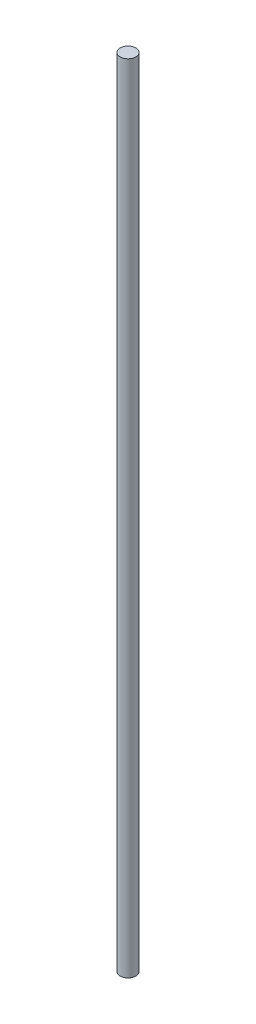
ISO-10303-21;
HEADER;
FILE_DESCRIPTION(('STEP AP214'),'2;1');
FILE_NAME('part.step','',(''),(''),'','','');
FILE_SCHEMA(('AUTOMOTIVE_DESIGN { 1 0 10303 214 1 1 1 1 }'));
ENDSEC;
DATA;
#1=APPLICATION_CONTEXT('core data for automotive mechanical design processes');
#2=APPLICATION_PROTOCOL_DEFINITION('international standard','automotive_design',2000,#1);
#3=PRODUCT_CONTEXT('',#1,'mechanical');
#4=PRODUCT('Part','Part','',(#3));
#5=PRODUCT_RELATED_PRODUCT_CATEGORY('part','',(#4));
#6=PRODUCT_DEFINITION_FORMATION('','',#4);
#7=PRODUCT_DEFINITION_CONTEXT('part definition',#1,'design');
#8=PRODUCT_DEFINITION('design','',#6,#7);
#9=PRODUCT_DEFINITION_SHAPE('','',#8);
#10=(LENGTH_UNIT() NAMED_UNIT(*) SI_UNIT(.MILLI.,.METRE.));
#11=(NAMED_UNIT(*) PLANE_ANGLE_UNIT() SI_UNIT($,.RADIAN.));
#12=(NAMED_UNIT(*) SI_UNIT($,.STERADIAN.) SOLID_ANGLE_UNIT());
#13=UNCERTAINTY_MEASURE_WITH_UNIT(LENGTH_MEASURE(1.E-05),#10,'distance_accuracy_value','');
#14=(GEOMETRIC_REPRESENTATION_CONTEXT(3) GLOBAL_UNCERTAINTY_ASSIGNED_CONTEXT((#13)) GLOBAL_UNIT_ASSIGNED_CONTEXT((#10,
#11,#12)) REPRESENTATION_CONTEXT('',''));
#15=CARTESIAN_POINT('',(0.,0.,0.));
#16=DIRECTION('',(0.,0.,1.));
#17=DIRECTION('',(1.,0.,0.));
#18=AXIS2_PLACEMENT_3D('',#15,#16,#17);
#19=CARTESIAN_POINT('',(0.,508.,0.));
#20=DIRECTION('',(0.,-1.,0.));
#21=DIRECTION('',(0.,0.,-1.));
#22=AXIS2_PLACEMENT_3D('',#19,#20,#21);
#23=CYLINDRICAL_SURFACE('',#22,5.);
#24=CARTESIAN_POINT('',(0.,508.,0.));
#25=DIRECTION('',(0.,1.,0.));
#26=DIRECTION('',(0.,0.,1.));
#27=AXIS2_PLACEMENT_3D('',#24,#25,#26);
#28=CIRCLE('',#27,5.);
#29=CARTESIAN_POINT('',(0.,508.,5.));
#30=VERTEX_POINT('',#29);
#31=EDGE_CURVE('E10',#30,#30,#28,.T.);
#32=ORIENTED_EDGE('',*,*,#31,.F.);
#33=EDGE_LOOP('',(#32));
#34=FACE_BOUND('',#33,.T.);
#35=CARTESIAN_POINT('',(0.,0.,0.));
#36=DIRECTION('',(0.,1.,0.));
#37=DIRECTION('',(0.,0.,1.));
#38=AXIS2_PLACEMENT_3D('',#35,#36,#37);
#39=CIRCLE('',#38,5.);
#40=CARTESIAN_POINT('',(0.,0.,5.));
#41=VERTEX_POINT('',#40);
#42=EDGE_CURVE('E44',#41,#41,#39,.T.);
#43=ORIENTED_EDGE('',*,*,#42,.T.);
#44=EDGE_LOOP('',(#43));
#45=FACE_BOUND('',#44,.T.);
#46=ADVANCED_FACE('F41',(#34,#45),#23,.T.);
#47=CARTESIAN_POINT('',(0.,508.,0.));
#48=DIRECTION('',(0.,1.,0.));
#49=DIRECTION('',(0.,0.,1.));
#50=AXIS2_PLACEMENT_3D('',#47,#48,#49);
#51=PLANE('',#50);
#52=ORIENTED_EDGE('',*,*,#31,.T.);
#53=EDGE_LOOP('',(#52));
#54=FACE_BOUND('',#53,.T.);
#55=ADVANCED_FACE('F56',(#54),#51,.T.);
#56=CARTESIAN_POINT('',(0.,0.,0.));
#57=DIRECTION('',(0.,1.,0.));
#58=DIRECTION('',(0.,0.,1.));
#59=AXIS2_PLACEMENT_3D('',#56,#57,#58);
#60=PLANE('',#59);
#61=ORIENTED_EDGE('',*,*,#42,.F.);
#62=EDGE_LOOP('',(#61));
#63=FACE_BOUND('',#62,.T.);
#64=ADVANCED_FACE('F54',(#63),#60,.F.);
#65=CLOSED_SHELL('',(#46,#55,#64));
#66=MANIFOLD_SOLID_BREP('B2',#65);
#67=ADVANCED_BREP_SHAPE_REPRESENTATION('',(#18,#66),#14);
#68=SHAPE_DEFINITION_REPRESENTATION(#9,#67);
ENDSEC;
END-ISO-10303-21;
